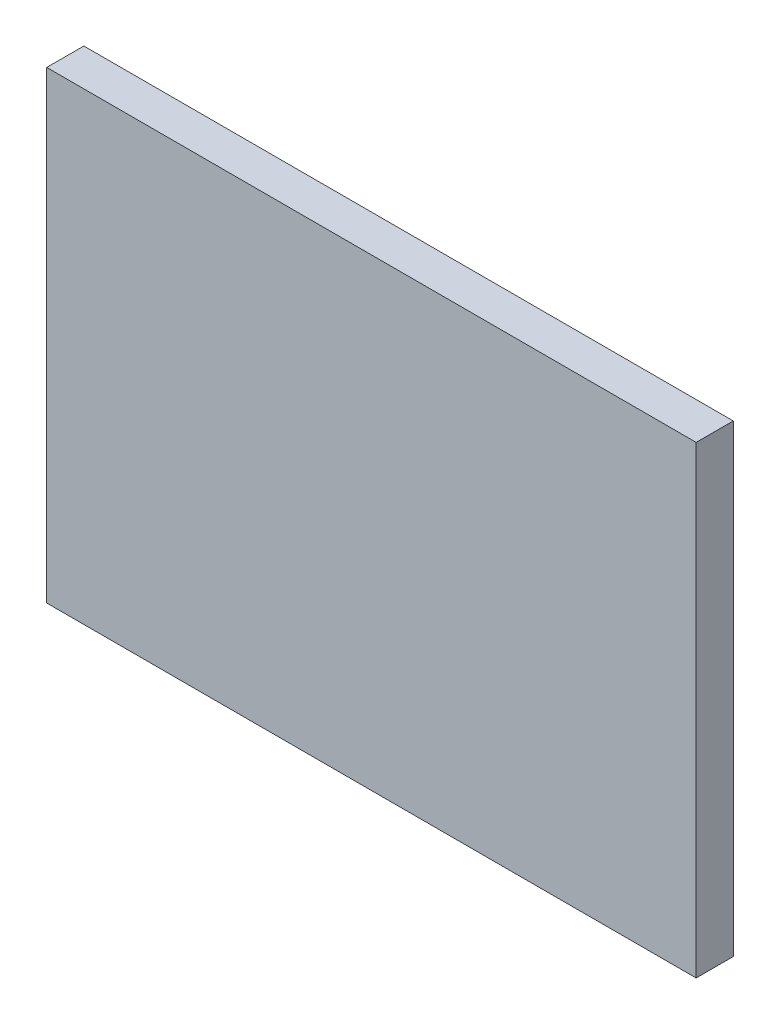
ISO-10303-21;
HEADER;
FILE_DESCRIPTION(('STEP AP214'),'2;1');
FILE_NAME('part.step','',(''),(''),'','','');
FILE_SCHEMA(('AUTOMOTIVE_DESIGN { 1 0 10303 214 1 1 1 1 }'));
ENDSEC;
DATA;
#1=APPLICATION_CONTEXT('core data for automotive mechanical design processes');
#2=APPLICATION_PROTOCOL_DEFINITION('international standard','automotive_design',2000,#1);
#3=PRODUCT_CONTEXT('',#1,'mechanical');
#4=PRODUCT('Part','Part','',(#3));
#5=PRODUCT_RELATED_PRODUCT_CATEGORY('part','',(#4));
#6=PRODUCT_DEFINITION_FORMATION('','',#4);
#7=PRODUCT_DEFINITION_CONTEXT('part definition',#1,'design');
#8=PRODUCT_DEFINITION('design','',#6,#7);
#9=PRODUCT_DEFINITION_SHAPE('','',#8);
#10=(LENGTH_UNIT() NAMED_UNIT(*) SI_UNIT(.MILLI.,.METRE.));
#11=(NAMED_UNIT(*) PLANE_ANGLE_UNIT() SI_UNIT($,.RADIAN.));
#12=(NAMED_UNIT(*) SI_UNIT($,.STERADIAN.) SOLID_ANGLE_UNIT());
#13=UNCERTAINTY_MEASURE_WITH_UNIT(LENGTH_MEASURE(1.E-05),#10,'distance_accuracy_value','');
#14=(GEOMETRIC_REPRESENTATION_CONTEXT(3) GLOBAL_UNCERTAINTY_ASSIGNED_CONTEXT((#13)) GLOBAL_UNIT_ASSIGNED_CONTEXT((#10,
#11,#12)) REPRESENTATION_CONTEXT('',''));
#15=CARTESIAN_POINT('',(0.,0.,0.));
#16=DIRECTION('',(0.,0.,1.));
#17=DIRECTION('',(1.,0.,0.));
#18=AXIS2_PLACEMENT_3D('',#15,#16,#17);
#19=CARTESIAN_POINT('',(-4.45,3.350000011003,0.76));
#20=DIRECTION('',(0.,0.,1.));
#21=DIRECTION('',(1.,0.,0.));
#22=AXIS2_PLACEMENT_3D('',#19,#20,#21);
#23=PLANE('',#22);
#24=DIRECTION('',(0.,1.,0.));
#25=VECTOR('',#24,1.);
#26=CARTESIAN_POINT('',(-11.45,3.350000011003,0.76));
#27=LINE('',#26,#25);
#28=CARTESIAN_POINT('',(-11.45,8.350000011003,0.76));
#29=VERTEX_POINT('',#28);
#30=CARTESIAN_POINT('',(-11.45,-1.649999988997,0.76));
#31=VERTEX_POINT('',#30);
#32=EDGE_CURVE('E20',#29,#31,#27,.F.);
#33=ORIENTED_EDGE('',*,*,#32,.F.);
#34=DIRECTION('',(1.,0.,0.));
#35=VECTOR('',#34,1.);
#36=CARTESIAN_POINT('',(-4.45,8.350000011003,0.76));
#37=LINE('',#36,#35);
#38=CARTESIAN_POINT('',(2.55,8.350000011003,0.76));
#39=VERTEX_POINT('',#38);
#40=EDGE_CURVE('E80',#39,#29,#37,.F.);
#41=ORIENTED_EDGE('',*,*,#40,.F.);
#42=DIRECTION('',(0.,1.,0.));
#43=VECTOR('',#42,1.);
#44=CARTESIAN_POINT('',(2.55,3.350000011003,0.76));
#45=LINE('',#44,#43);
#46=CARTESIAN_POINT('',(2.55,-1.649999988997,0.76));
#47=VERTEX_POINT('',#46);
#48=EDGE_CURVE('E68',#47,#39,#45,.T.);
#49=ORIENTED_EDGE('',*,*,#48,.F.);
#50=DIRECTION('',(1.,0.,0.));
#51=VECTOR('',#50,1.);
#52=CARTESIAN_POINT('',(-4.45,-1.649999988997,0.76));
#53=LINE('',#52,#51);
#54=EDGE_CURVE('E55',#31,#47,#53,.T.);
#55=ORIENTED_EDGE('',*,*,#54,.F.);
#56=EDGE_LOOP('',(#33,#41,#49,#55));
#57=FACE_BOUND('',#56,.T.);
#58=ADVANCED_FACE('F17',(#57),#23,.F.);
#59=CARTESIAN_POINT('',(-11.45,3.350000011003,0.76));
#60=DIRECTION('',(-1.,0.,0.));
#61=DIRECTION('',(0.,0.,1.));
#62=AXIS2_PLACEMENT_3D('',#59,#60,#61);
#63=PLANE('',#62);
#64=ORIENTED_EDGE('',*,*,#32,.T.);
#65=DIRECTION('',(0.,0.,-1.));
#66=VECTOR('',#65,1.);
#67=CARTESIAN_POINT('',(-11.45,-1.649999988997,0.76));
#68=LINE('',#67,#66);
#69=CARTESIAN_POINT('',(-11.45,-1.649999988997,1.56));
#70=VERTEX_POINT('',#69);
#71=EDGE_CURVE('E61',#70,#31,#68,.T.);
#72=ORIENTED_EDGE('',*,*,#71,.F.);
#73=DIRECTION('',(0.,1.,0.));
#74=VECTOR('',#73,1.);
#75=CARTESIAN_POINT('',(-11.45,3.350000011003,1.56));
#76=LINE('',#75,#74);
#77=CARTESIAN_POINT('',(-11.45,8.350000011003,1.56));
#78=VERTEX_POINT('',#77);
#79=EDGE_CURVE('E83',#78,#70,#76,.F.);
#80=ORIENTED_EDGE('',*,*,#79,.F.);
#81=DIRECTION('',(0.,0.,1.));
#82=VECTOR('',#81,1.);
#83=CARTESIAN_POINT('',(-11.45,8.350000011003,0.76));
#84=LINE('',#83,#82);
#85=EDGE_CURVE('E64',#29,#78,#84,.T.);
#86=ORIENTED_EDGE('',*,*,#85,.F.);
#87=EDGE_LOOP('',(#64,#72,#80,#86));
#88=FACE_BOUND('',#87,.T.);
#89=ADVANCED_FACE('F60',(#88),#63,.T.);
#90=CARTESIAN_POINT('',(-4.45,-1.649999988997,0.76));
#91=DIRECTION('',(0.,-1.,0.));
#92=DIRECTION('',(0.,0.,-1.));
#93=AXIS2_PLACEMENT_3D('',#90,#91,#92);
#94=PLANE('',#93);
#95=ORIENTED_EDGE('',*,*,#54,.T.);
#96=DIRECTION('',(0.,0.,-1.));
#97=VECTOR('',#96,1.);
#98=CARTESIAN_POINT('',(2.55,-1.649999988997,0.76));
#99=LINE('',#98,#97);
#100=CARTESIAN_POINT('',(2.55,-1.649999988997,1.56));
#101=VERTEX_POINT('',#100);
#102=EDGE_CURVE('E70',#101,#47,#99,.T.);
#103=ORIENTED_EDGE('',*,*,#102,.F.);
#104=DIRECTION('',(1.,0.,0.));
#105=VECTOR('',#104,1.);
#106=CARTESIAN_POINT('',(-4.45,-1.649999988997,1.56));
#107=LINE('',#106,#105);
#108=EDGE_CURVE('E74',#70,#101,#107,.T.);
#109=ORIENTED_EDGE('',*,*,#108,.F.);
#110=ORIENTED_EDGE('',*,*,#71,.T.);
#111=EDGE_LOOP('',(#95,#103,#109,#110));
#112=FACE_BOUND('',#111,.T.);
#113=ADVANCED_FACE('F72',(#112),#94,.T.);
#114=CARTESIAN_POINT('',(2.55,3.350000011003,0.76));
#115=DIRECTION('',(1.,0.,0.));
#116=DIRECTION('',(0.,0.,-1.));
#117=AXIS2_PLACEMENT_3D('',#114,#115,#116);
#118=PLANE('',#117);
#119=ORIENTED_EDGE('',*,*,#48,.T.);
#120=DIRECTION('',(0.,0.,1.));
#121=VECTOR('',#120,1.);
#122=CARTESIAN_POINT('',(2.55,8.350000011003,0.76));
#123=LINE('',#122,#121);
#124=CARTESIAN_POINT('',(2.55,8.350000011003,1.56));
#125=VERTEX_POINT('',#124);
#126=EDGE_CURVE('E35',#125,#39,#123,.F.);
#127=ORIENTED_EDGE('',*,*,#126,.F.);
#128=DIRECTION('',(0.,1.,0.));
#129=VECTOR('',#128,1.);
#130=CARTESIAN_POINT('',(2.55,3.350000011003,1.56));
#131=LINE('',#130,#129);
#132=EDGE_CURVE('E26',#101,#125,#131,.T.);
#133=ORIENTED_EDGE('',*,*,#132,.F.);
#134=ORIENTED_EDGE('',*,*,#102,.T.);
#135=EDGE_LOOP('',(#119,#127,#133,#134));
#136=FACE_BOUND('',#135,.T.);
#137=ADVANCED_FACE('F89',(#136),#118,.T.);
#138=CARTESIAN_POINT('',(-4.45,8.350000011003,0.76));
#139=DIRECTION('',(0.,1.,0.));
#140=DIRECTION('',(0.,0.,1.));
#141=AXIS2_PLACEMENT_3D('',#138,#139,#140);
#142=PLANE('',#141);
#143=ORIENTED_EDGE('',*,*,#40,.T.);
#144=ORIENTED_EDGE('',*,*,#85,.T.);
#145=DIRECTION('',(1.,0.,0.));
#146=VECTOR('',#145,1.);
#147=CARTESIAN_POINT('',(-4.45,8.350000011003,1.56));
#148=LINE('',#147,#146);
#149=EDGE_CURVE('E11',#125,#78,#148,.F.);
#150=ORIENTED_EDGE('',*,*,#149,.F.);
#151=ORIENTED_EDGE('',*,*,#126,.T.);
#152=EDGE_LOOP('',(#143,#144,#150,#151));
#153=FACE_BOUND('',#152,.T.);
#154=ADVANCED_FACE('F91',(#153),#142,.T.);
#155=CARTESIAN_POINT('',(-4.45,3.350000011003,1.56));
#156=DIRECTION('',(0.,0.,1.));
#157=DIRECTION('',(1.,0.,0.));
#158=AXIS2_PLACEMENT_3D('',#155,#156,#157);
#159=PLANE('',#158);
#160=ORIENTED_EDGE('',*,*,#132,.T.);
#161=ORIENTED_EDGE('',*,*,#149,.T.);
#162=ORIENTED_EDGE('',*,*,#79,.T.);
#163=ORIENTED_EDGE('',*,*,#108,.T.);
#164=EDGE_LOOP('',(#160,#161,#162,#163));
#165=FACE_BOUND('',#164,.T.);
#166=ADVANCED_FACE('F88',(#165),#159,.T.);
#167=CLOSED_SHELL('',(#58,#89,#113,#137,#154,#166));
#168=MANIFOLD_SOLID_BREP('B1',#167);
#169=ADVANCED_BREP_SHAPE_REPRESENTATION('',(#18,#168),#14);
#170=SHAPE_DEFINITION_REPRESENTATION(#9,#169);
ENDSEC;
END-ISO-10303-21;
